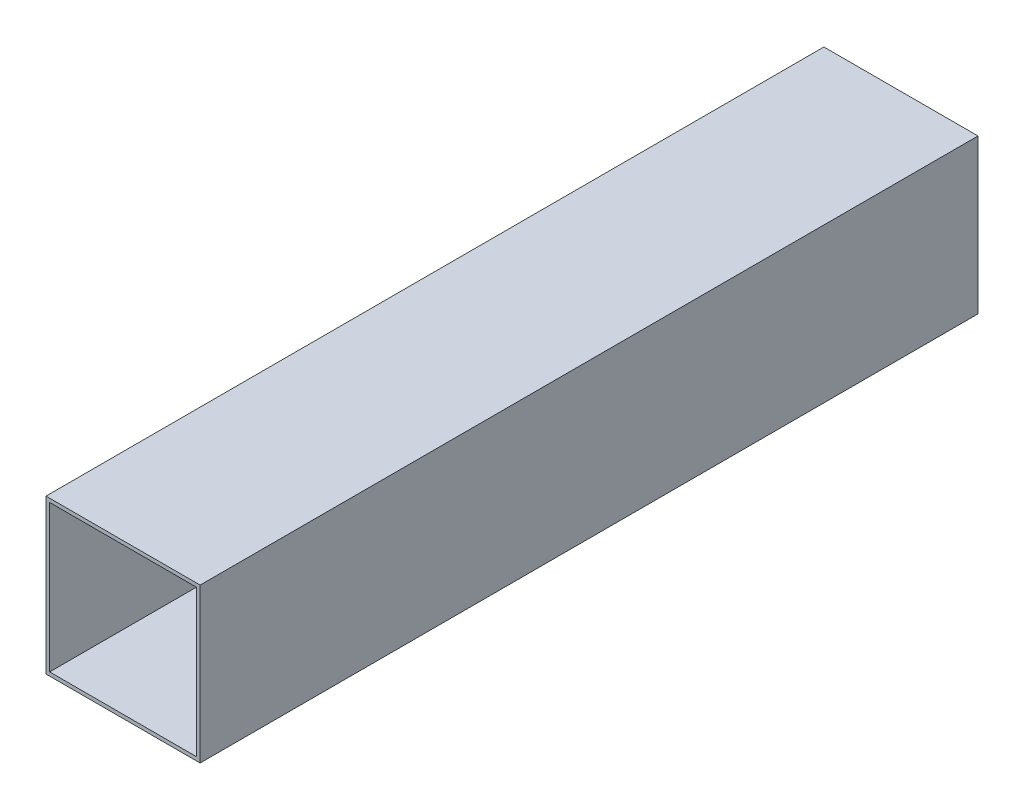
ISO-10303-21;
HEADER;
FILE_DESCRIPTION(('STEP AP214'),'2;1');
FILE_NAME('part.step','',(''),(''),'','','');
FILE_SCHEMA(('AUTOMOTIVE_DESIGN { 1 0 10303 214 1 1 1 1 }'));
ENDSEC;
DATA;
#1=APPLICATION_CONTEXT('core data for automotive mechanical design processes');
#2=APPLICATION_PROTOCOL_DEFINITION('international standard','automotive_design',2000,#1);
#3=PRODUCT_CONTEXT('',#1,'mechanical');
#4=PRODUCT('Part','Part','',(#3));
#5=PRODUCT_RELATED_PRODUCT_CATEGORY('part','',(#4));
#6=PRODUCT_DEFINITION_FORMATION('','',#4);
#7=PRODUCT_DEFINITION_CONTEXT('part definition',#1,'design');
#8=PRODUCT_DEFINITION('design','',#6,#7);
#9=PRODUCT_DEFINITION_SHAPE('','',#8);
#10=(LENGTH_UNIT() NAMED_UNIT(*) SI_UNIT(.MILLI.,.METRE.));
#11=(NAMED_UNIT(*) PLANE_ANGLE_UNIT() SI_UNIT($,.RADIAN.));
#12=(NAMED_UNIT(*) SI_UNIT($,.STERADIAN.) SOLID_ANGLE_UNIT());
#13=UNCERTAINTY_MEASURE_WITH_UNIT(LENGTH_MEASURE(1.E-05),#10,'distance_accuracy_value','');
#14=(GEOMETRIC_REPRESENTATION_CONTEXT(3) GLOBAL_UNCERTAINTY_ASSIGNED_CONTEXT((#13)) GLOBAL_UNIT_ASSIGNED_CONTEXT((#10,
#11,#12)) REPRESENTATION_CONTEXT('',''));
#15=CARTESIAN_POINT('',(0.,0.,0.));
#16=DIRECTION('',(0.,0.,1.));
#17=DIRECTION('',(1.,0.,0.));
#18=AXIS2_PLACEMENT_3D('',#15,#16,#17);
#19=CARTESIAN_POINT('',(0.,0.,530.));
#20=DIRECTION('',(0.,0.,1.));
#21=DIRECTION('',(1.,0.,0.));
#22=AXIS2_PLACEMENT_3D('',#19,#20,#21);
#23=PLANE('',#22);
#24=DIRECTION('',(0.,1.,0.));
#25=VECTOR('',#24,1.);
#26=CARTESIAN_POINT('',(52.5,52.5,530.));
#27=LINE('',#26,#25);
#28=CARTESIAN_POINT('',(52.5,-52.5,530.));
#29=VERTEX_POINT('',#28);
#30=CARTESIAN_POINT('',(52.5,52.5,530.));
#31=VERTEX_POINT('',#30);
#32=EDGE_CURVE('E242',#29,#31,#27,.T.);
#33=ORIENTED_EDGE('',*,*,#32,.T.);
#34=DIRECTION('',(-1.,0.,0.));
#35=VECTOR('',#34,1.);
#36=CARTESIAN_POINT('',(-52.5,52.5,530.));
#37=LINE('',#36,#35);
#38=CARTESIAN_POINT('',(-52.5,52.5,530.));
#39=VERTEX_POINT('',#38);
#40=EDGE_CURVE('E246',#31,#39,#37,.T.);
#41=ORIENTED_EDGE('',*,*,#40,.T.);
#42=DIRECTION('',(0.,-1.,0.));
#43=VECTOR('',#42,1.);
#44=CARTESIAN_POINT('',(-52.5,52.5,530.));
#45=LINE('',#44,#43);
#46=CARTESIAN_POINT('',(-52.5,-52.5,530.));
#47=VERTEX_POINT('',#46);
#48=EDGE_CURVE('E250',#39,#47,#45,.T.);
#49=ORIENTED_EDGE('',*,*,#48,.T.);
#50=DIRECTION('',(1.,0.,0.));
#51=VECTOR('',#50,1.);
#52=CARTESIAN_POINT('',(-52.5,-52.5,530.));
#53=LINE('',#52,#51);
#54=EDGE_CURVE('E253',#47,#29,#53,.T.);
#55=ORIENTED_EDGE('',*,*,#54,.T.);
#56=EDGE_LOOP('',(#33,#41,#49,#55));
#57=FACE_BOUND('',#56,.T.);
#58=DIRECTION('',(-1.,0.,0.));
#59=VECTOR('',#58,1.);
#60=CARTESIAN_POINT('',(-50.,50.,530.));
#61=LINE('',#60,#59);
#62=CARTESIAN_POINT('',(50.,50.,530.));
#63=VERTEX_POINT('',#62);
#64=CARTESIAN_POINT('',(-50.,50.,530.));
#65=VERTEX_POINT('',#64);
#66=EDGE_CURVE('E202',#63,#65,#61,.T.);
#67=ORIENTED_EDGE('',*,*,#66,.F.);
#68=DIRECTION('',(0.,1.,0.));
#69=VECTOR('',#68,1.);
#70=CARTESIAN_POINT('',(50.,-50.,530.));
#71=LINE('',#70,#69);
#72=CARTESIAN_POINT('',(50.,-50.,530.));
#73=VERTEX_POINT('',#72);
#74=EDGE_CURVE('E199',#73,#63,#71,.T.);
#75=ORIENTED_EDGE('',*,*,#74,.F.);
#76=DIRECTION('',(1.,0.,0.));
#77=VECTOR('',#76,1.);
#78=CARTESIAN_POINT('',(-50.,-50.,530.));
#79=LINE('',#78,#77);
#80=CARTESIAN_POINT('',(-50.,-50.,530.));
#81=VERTEX_POINT('',#80);
#82=EDGE_CURVE('E210',#81,#73,#79,.T.);
#83=ORIENTED_EDGE('',*,*,#82,.F.);
#84=DIRECTION('',(0.,-1.,0.));
#85=VECTOR('',#84,1.);
#86=CARTESIAN_POINT('',(-50.,-50.,530.));
#87=LINE('',#86,#85);
#88=EDGE_CURVE('E206',#65,#81,#87,.T.);
#89=ORIENTED_EDGE('',*,*,#88,.F.);
#90=EDGE_LOOP('',(#67,#75,#83,#89));
#91=FACE_BOUND('',#90,.T.);
#92=ADVANCED_FACE('F38',(#57,#91),#23,.T.);
#93=CARTESIAN_POINT('',(0.,0.,0.));
#94=DIRECTION('',(0.,0.,1.));
#95=DIRECTION('',(1.,0.,0.));
#96=AXIS2_PLACEMENT_3D('',#93,#94,#95);
#97=PLANE('',#96);
#98=DIRECTION('',(0.,1.,0.));
#99=VECTOR('',#98,1.);
#100=CARTESIAN_POINT('',(52.5,52.5,0.));
#101=LINE('',#100,#99);
#102=CARTESIAN_POINT('',(52.5,-52.5,0.));
#103=VERTEX_POINT('',#102);
#104=CARTESIAN_POINT('',(52.5,52.5,0.));
#105=VERTEX_POINT('',#104);
#106=EDGE_CURVE('E241',#103,#105,#101,.T.);
#107=ORIENTED_EDGE('',*,*,#106,.F.);
#108=DIRECTION('',(1.,0.,0.));
#109=VECTOR('',#108,1.);
#110=CARTESIAN_POINT('',(-52.5,-52.5,0.));
#111=LINE('',#110,#109);
#112=CARTESIAN_POINT('',(-52.5,-52.5,0.));
#113=VERTEX_POINT('',#112);
#114=EDGE_CURVE('E247',#113,#103,#111,.T.);
#115=ORIENTED_EDGE('',*,*,#114,.F.);
#116=DIRECTION('',(0.,-1.,0.));
#117=VECTOR('',#116,1.);
#118=CARTESIAN_POINT('',(-52.5,52.5,0.));
#119=LINE('',#118,#117);
#120=CARTESIAN_POINT('',(-52.5,52.5,0.));
#121=VERTEX_POINT('',#120);
#122=EDGE_CURVE('E263',#121,#113,#119,.T.);
#123=ORIENTED_EDGE('',*,*,#122,.F.);
#124=DIRECTION('',(-1.,0.,0.));
#125=VECTOR('',#124,1.);
#126=CARTESIAN_POINT('',(-52.5,52.5,0.));
#127=LINE('',#126,#125);
#128=EDGE_CURVE('E260',#105,#121,#127,.T.);
#129=ORIENTED_EDGE('',*,*,#128,.F.);
#130=EDGE_LOOP('',(#107,#115,#123,#129));
#131=FACE_BOUND('',#130,.T.);
#132=DIRECTION('',(0.,1.,0.));
#133=VECTOR('',#132,1.);
#134=CARTESIAN_POINT('',(50.,-50.,0.));
#135=LINE('',#134,#133);
#136=CARTESIAN_POINT('',(50.,-50.,0.));
#137=VERTEX_POINT('',#136);
#138=CARTESIAN_POINT('',(50.,50.,0.));
#139=VERTEX_POINT('',#138);
#140=EDGE_CURVE('E198',#137,#139,#135,.T.);
#141=ORIENTED_EDGE('',*,*,#140,.T.);
#142=DIRECTION('',(-1.,0.,0.));
#143=VECTOR('',#142,1.);
#144=CARTESIAN_POINT('',(-50.,50.,0.));
#145=LINE('',#144,#143);
#146=CARTESIAN_POINT('',(-50.,50.,0.));
#147=VERTEX_POINT('',#146);
#148=EDGE_CURVE('E217',#139,#147,#145,.T.);
#149=ORIENTED_EDGE('',*,*,#148,.T.);
#150=DIRECTION('',(0.,-1.,0.));
#151=VECTOR('',#150,1.);
#152=CARTESIAN_POINT('',(-50.,-50.,0.));
#153=LINE('',#152,#151);
#154=CARTESIAN_POINT('',(-50.,-50.,0.));
#155=VERTEX_POINT('',#154);
#156=EDGE_CURVE('E221',#147,#155,#153,.T.);
#157=ORIENTED_EDGE('',*,*,#156,.T.);
#158=DIRECTION('',(1.,0.,0.));
#159=VECTOR('',#158,1.);
#160=CARTESIAN_POINT('',(-50.,-50.,0.));
#161=LINE('',#160,#159);
#162=EDGE_CURVE('E203',#155,#137,#161,.T.);
#163=ORIENTED_EDGE('',*,*,#162,.T.);
#164=EDGE_LOOP('',(#141,#149,#157,#163));
#165=FACE_BOUND('',#164,.T.);
#166=ADVANCED_FACE('F354',(#131,#165),#97,.F.);
#167=CARTESIAN_POINT('',(52.5,52.5,530.));
#168=DIRECTION('',(-1.,0.,0.));
#169=DIRECTION('',(0.,-1.,0.));
#170=AXIS2_PLACEMENT_3D('',#167,#168,#169);
#171=PLANE('',#170);
#172=ORIENTED_EDGE('',*,*,#106,.T.);
#173=DIRECTION('',(0.,0.,-1.));
#174=VECTOR('',#173,1.);
#175=CARTESIAN_POINT('',(52.5,52.5,530.));
#176=LINE('',#175,#174);
#177=EDGE_CURVE('E279',#31,#105,#176,.T.);
#178=ORIENTED_EDGE('',*,*,#177,.F.);
#179=ORIENTED_EDGE('',*,*,#32,.F.);
#180=DIRECTION('',(0.,0.,-1.));
#181=VECTOR('',#180,1.);
#182=CARTESIAN_POINT('',(52.5,-52.5,530.));
#183=LINE('',#182,#181);
#184=EDGE_CURVE('E256',#29,#103,#183,.T.);
#185=ORIENTED_EDGE('',*,*,#184,.T.);
#186=EDGE_LOOP('',(#172,#178,#179,#185));
#187=FACE_BOUND('',#186,.T.);
#188=ADVANCED_FACE('F40',(#187),#171,.F.);
#189=CARTESIAN_POINT('',(-52.5,52.5,530.));
#190=DIRECTION('',(0.,-1.,0.));
#191=DIRECTION('',(0.,0.,-1.));
#192=AXIS2_PLACEMENT_3D('',#189,#190,#191);
#193=PLANE('',#192);
#194=ORIENTED_EDGE('',*,*,#128,.T.);
#195=DIRECTION('',(0.,0.,-1.));
#196=VECTOR('',#195,1.);
#197=CARTESIAN_POINT('',(-52.5,52.5,530.));
#198=LINE('',#197,#196);
#199=EDGE_CURVE('E275',#39,#121,#198,.T.);
#200=ORIENTED_EDGE('',*,*,#199,.F.);
#201=ORIENTED_EDGE('',*,*,#40,.F.);
#202=ORIENTED_EDGE('',*,*,#177,.T.);
#203=EDGE_LOOP('',(#194,#200,#201,#202));
#204=FACE_BOUND('',#203,.T.);
#205=ADVANCED_FACE('F389',(#204),#193,.F.);
#206=CARTESIAN_POINT('',(-52.5,52.5,530.));
#207=DIRECTION('',(1.,0.,0.));
#208=DIRECTION('',(0.,1.,0.));
#209=AXIS2_PLACEMENT_3D('',#206,#207,#208);
#210=PLANE('',#209);
#211=ORIENTED_EDGE('',*,*,#122,.T.);
#212=DIRECTION('',(0.,0.,-1.));
#213=VECTOR('',#212,1.);
#214=CARTESIAN_POINT('',(-52.5,-52.5,530.));
#215=LINE('',#214,#213);
#216=EDGE_CURVE('E271',#47,#113,#215,.T.);
#217=ORIENTED_EDGE('',*,*,#216,.F.);
#218=ORIENTED_EDGE('',*,*,#48,.F.);
#219=ORIENTED_EDGE('',*,*,#199,.T.);
#220=EDGE_LOOP('',(#211,#217,#218,#219));
#221=FACE_BOUND('',#220,.T.);
#222=ADVANCED_FACE('F386',(#221),#210,.F.);
#223=CARTESIAN_POINT('',(-52.5,-52.5,530.));
#224=DIRECTION('',(0.,1.,0.));
#225=DIRECTION('',(0.,0.,1.));
#226=AXIS2_PLACEMENT_3D('',#223,#224,#225);
#227=PLANE('',#226);
#228=DIRECTION('',(-1.,0.,0.));
#229=VECTOR('',#228,1.);
#230=CARTESIAN_POINT('',(-52.5000000000002,-52.5,90.));
#231=LINE('',#230,#229);
#232=CARTESIAN_POINT('',(35.9607942738874,-52.5,90.));
#233=VERTEX_POINT('',#232);
#234=CARTESIAN_POINT('',(-34.0392057261126,-52.5,90.));
#235=VERTEX_POINT('',#234);
#236=EDGE_CURVE('E190',#233,#235,#231,.T.);
#237=ORIENTED_EDGE('',*,*,#236,.T.);
#238=DIRECTION('',(0.,0.,1.));
#239=VECTOR('',#238,1.);
#240=CARTESIAN_POINT('',(-34.0392057261126,-52.5,530.));
#241=LINE('',#240,#239);
#242=CARTESIAN_POINT('',(-34.0392057261126,-52.5,150.));
#243=VERTEX_POINT('',#242);
#244=EDGE_CURVE('E194',#235,#243,#241,.T.);
#245=ORIENTED_EDGE('',*,*,#244,.T.);
#246=DIRECTION('',(1.,0.,0.));
#247=VECTOR('',#246,1.);
#248=CARTESIAN_POINT('',(-52.5000000000001,-52.5,150.));
#249=LINE('',#248,#247);
#250=CARTESIAN_POINT('',(35.9607942738875,-52.5,150.));
#251=VERTEX_POINT('',#250);
#252=EDGE_CURVE('E177',#243,#251,#249,.T.);
#253=ORIENTED_EDGE('',*,*,#252,.T.);
#254=DIRECTION('',(0.,0.,-1.));
#255=VECTOR('',#254,1.);
#256=CARTESIAN_POINT('',(35.9607942738875,-52.5,530.));
#257=LINE('',#256,#255);
#258=EDGE_CURVE('E182',#251,#233,#257,.T.);
#259=ORIENTED_EDGE('',*,*,#258,.T.);
#260=EDGE_LOOP('',(#237,#245,#253,#259));
#261=FACE_BOUND('',#260,.T.);
#262=DIRECTION('',(-1.,0.,0.));
#263=VECTOR('',#262,1.);
#264=CARTESIAN_POINT('',(-52.5,-52.5,300.));
#265=LINE('',#264,#263);
#266=CARTESIAN_POINT('',(35.9607942738874,-52.5,300.));
#267=VERTEX_POINT('',#266);
#268=CARTESIAN_POINT('',(-34.0392057261126,-52.5,300.));
#269=VERTEX_POINT('',#268);
#270=EDGE_CURVE('E175',#267,#269,#265,.T.);
#271=ORIENTED_EDGE('',*,*,#270,.T.);
#272=DIRECTION('',(0.,0.,1.));
#273=VECTOR('',#272,1.);
#274=CARTESIAN_POINT('',(-34.0392057261126,-52.5,530.));
#275=LINE('',#274,#273);
#276=CARTESIAN_POINT('',(-34.0392057261126,-52.5,360.));
#277=VERTEX_POINT('',#276);
#278=EDGE_CURVE('E165',#269,#277,#275,.T.);
#279=ORIENTED_EDGE('',*,*,#278,.T.);
#280=DIRECTION('',(1.,0.,0.));
#281=VECTOR('',#280,1.);
#282=CARTESIAN_POINT('',(-52.5,-52.5,360.));
#283=LINE('',#282,#281);
#284=CARTESIAN_POINT('',(35.9607942738875,-52.5,360.));
#285=VERTEX_POINT('',#284);
#286=EDGE_CURVE('E150',#277,#285,#283,.T.);
#287=ORIENTED_EDGE('',*,*,#286,.T.);
#288=DIRECTION('',(0.,0.,-1.));
#289=VECTOR('',#288,1.);
#290=CARTESIAN_POINT('',(35.9607942738875,-52.5,530.));
#291=LINE('',#290,#289);
#292=EDGE_CURVE('E159',#285,#267,#291,.T.);
#293=ORIENTED_EDGE('',*,*,#292,.T.);
#294=EDGE_LOOP('',(#271,#279,#287,#293));
#295=FACE_BOUND('',#294,.T.);
#296=ORIENTED_EDGE('',*,*,#114,.T.);
#297=ORIENTED_EDGE('',*,*,#184,.F.);
#298=ORIENTED_EDGE('',*,*,#54,.F.);
#299=ORIENTED_EDGE('',*,*,#216,.T.);
#300=EDGE_LOOP('',(#296,#297,#298,#299));
#301=FACE_BOUND('',#300,.T.);
#302=ADVANCED_FACE('F173',(#261,#295,#301),#227,.F.);
#303=CARTESIAN_POINT('',(50.,-50.,530.));
#304=DIRECTION('',(-1.,0.,0.));
#305=DIRECTION('',(0.,0.,1.));
#306=AXIS2_PLACEMENT_3D('',#303,#304,#305);
#307=PLANE('',#306);
#308=ORIENTED_EDGE('',*,*,#140,.F.);
#309=DIRECTION('',(0.,0.,-1.));
#310=VECTOR('',#309,1.);
#311=CARTESIAN_POINT('',(50.,-50.,530.));
#312=LINE('',#311,#310);
#313=EDGE_CURVE('E213',#73,#137,#312,.T.);
#314=ORIENTED_EDGE('',*,*,#313,.F.);
#315=ORIENTED_EDGE('',*,*,#74,.T.);
#316=DIRECTION('',(0.,0.,-1.));
#317=VECTOR('',#316,1.);
#318=CARTESIAN_POINT('',(50.,50.,530.));
#319=LINE('',#318,#317);
#320=EDGE_CURVE('E237',#63,#139,#319,.T.);
#321=ORIENTED_EDGE('',*,*,#320,.T.);
#322=EDGE_LOOP('',(#308,#314,#315,#321));
#323=FACE_BOUND('',#322,.T.);
#324=ADVANCED_FACE('F363',(#323),#307,.T.);
#325=CARTESIAN_POINT('',(-50.,50.,530.));
#326=DIRECTION('',(0.,-1.,0.));
#327=DIRECTION('',(0.,0.,-1.));
#328=AXIS2_PLACEMENT_3D('',#325,#326,#327);
#329=PLANE('',#328);
#330=ORIENTED_EDGE('',*,*,#148,.F.);
#331=ORIENTED_EDGE('',*,*,#320,.F.);
#332=ORIENTED_EDGE('',*,*,#66,.T.);
#333=DIRECTION('',(0.,0.,-1.));
#334=VECTOR('',#333,1.);
#335=CARTESIAN_POINT('',(-50.,50.,530.));
#336=LINE('',#335,#334);
#337=EDGE_CURVE('E234',#65,#147,#336,.T.);
#338=ORIENTED_EDGE('',*,*,#337,.T.);
#339=EDGE_LOOP('',(#330,#331,#332,#338));
#340=FACE_BOUND('',#339,.T.);
#341=ADVANCED_FACE('F366',(#340),#329,.T.);
#342=CARTESIAN_POINT('',(-50.,-50.,530.));
#343=DIRECTION('',(1.,0.,0.));
#344=DIRECTION('',(0.,0.,-1.));
#345=AXIS2_PLACEMENT_3D('',#342,#343,#344);
#346=PLANE('',#345);
#347=ORIENTED_EDGE('',*,*,#156,.F.);
#348=ORIENTED_EDGE('',*,*,#337,.F.);
#349=ORIENTED_EDGE('',*,*,#88,.T.);
#350=DIRECTION('',(0.,0.,-1.));
#351=VECTOR('',#350,1.);
#352=CARTESIAN_POINT('',(-50.,-50.,530.));
#353=LINE('',#352,#351);
#354=EDGE_CURVE('E231',#81,#155,#353,.T.);
#355=ORIENTED_EDGE('',*,*,#354,.T.);
#356=EDGE_LOOP('',(#347,#348,#349,#355));
#357=FACE_BOUND('',#356,.T.);
#358=ADVANCED_FACE('F348',(#357),#346,.T.);
#359=CARTESIAN_POINT('',(-50.,-50.,530.));
#360=DIRECTION('',(0.,1.,0.));
#361=DIRECTION('',(0.,0.,1.));
#362=AXIS2_PLACEMENT_3D('',#359,#360,#361);
#363=PLANE('',#362);
#364=DIRECTION('',(0.,0.,1.));
#365=VECTOR('',#364,1.);
#366=CARTESIAN_POINT('',(-34.0392057261126,-50.,530.));
#367=LINE('',#366,#365);
#368=CARTESIAN_POINT('',(-34.0392057261126,-50.,90.));
#369=VERTEX_POINT('',#368);
#370=CARTESIAN_POINT('',(-34.0392057261126,-50.,150.));
#371=VERTEX_POINT('',#370);
#372=EDGE_CURVE('E11',#369,#371,#367,.T.);
#373=ORIENTED_EDGE('',*,*,#372,.F.);
#374=DIRECTION('',(-1.,0.,0.));
#375=VECTOR('',#374,1.);
#376=CARTESIAN_POINT('',(-50.0000000000003,-50.,90.));
#377=LINE('',#376,#375);
#378=CARTESIAN_POINT('',(35.9607942738874,-50.,90.));
#379=VERTEX_POINT('',#378);
#380=EDGE_CURVE('E47',#379,#369,#377,.T.);
#381=ORIENTED_EDGE('',*,*,#380,.F.);
#382=DIRECTION('',(0.,0.,-1.));
#383=VECTOR('',#382,1.);
#384=CARTESIAN_POINT('',(35.9607942738875,-50.,530.));
#385=LINE('',#384,#383);
#386=CARTESIAN_POINT('',(35.9607942738875,-50.,150.));
#387=VERTEX_POINT('',#386);
#388=EDGE_CURVE('E297',#387,#379,#385,.T.);
#389=ORIENTED_EDGE('',*,*,#388,.F.);
#390=DIRECTION('',(1.,0.,0.));
#391=VECTOR('',#390,1.);
#392=CARTESIAN_POINT('',(-50.0000000000002,-50.,150.));
#393=LINE('',#392,#391);
#394=EDGE_CURVE('E294',#371,#387,#393,.T.);
#395=ORIENTED_EDGE('',*,*,#394,.F.);
#396=EDGE_LOOP('',(#373,#381,#389,#395));
#397=FACE_BOUND('',#396,.T.);
#398=DIRECTION('',(0.,0.,1.));
#399=VECTOR('',#398,1.);
#400=CARTESIAN_POINT('',(-34.0392057261126,-50.,530.));
#401=LINE('',#400,#399);
#402=CARTESIAN_POINT('',(-34.0392057261126,-50.,300.));
#403=VERTEX_POINT('',#402);
#404=CARTESIAN_POINT('',(-34.0392057261126,-50.,360.));
#405=VERTEX_POINT('',#404);
#406=EDGE_CURVE('E168',#403,#405,#401,.T.);
#407=ORIENTED_EDGE('',*,*,#406,.F.);
#408=DIRECTION('',(-1.,0.,0.));
#409=VECTOR('',#408,1.);
#410=CARTESIAN_POINT('',(-50.,-50.,300.));
#411=LINE('',#410,#409);
#412=CARTESIAN_POINT('',(35.9607942738874,-50.,300.));
#413=VERTEX_POINT('',#412);
#414=EDGE_CURVE('E289',#413,#403,#411,.T.);
#415=ORIENTED_EDGE('',*,*,#414,.F.);
#416=DIRECTION('',(0.,0.,-1.));
#417=VECTOR('',#416,1.);
#418=CARTESIAN_POINT('',(35.9607942738875,-50.,530.));
#419=LINE('',#418,#417);
#420=CARTESIAN_POINT('',(35.9607942738875,-50.,360.));
#421=VERTEX_POINT('',#420);
#422=EDGE_CURVE('E286',#421,#413,#419,.T.);
#423=ORIENTED_EDGE('',*,*,#422,.F.);
#424=DIRECTION('',(1.,0.,0.));
#425=VECTOR('',#424,1.);
#426=CARTESIAN_POINT('',(-50.,-50.,360.));
#427=LINE('',#426,#425);
#428=EDGE_CURVE('E283',#405,#421,#427,.T.);
#429=ORIENTED_EDGE('',*,*,#428,.F.);
#430=EDGE_LOOP('',(#407,#415,#423,#429));
#431=FACE_BOUND('',#430,.T.);
#432=ORIENTED_EDGE('',*,*,#162,.F.);
#433=ORIENTED_EDGE('',*,*,#354,.F.);
#434=ORIENTED_EDGE('',*,*,#82,.T.);
#435=ORIENTED_EDGE('',*,*,#313,.T.);
#436=EDGE_LOOP('',(#432,#433,#434,#435));
#437=FACE_BOUND('',#436,.T.);
#438=ADVANCED_FACE('F317',(#397,#431,#437),#363,.T.);
#439=CARTESIAN_POINT('',(-34.0392057261126,-530.,300.));
#440=DIRECTION('',(-1.,0.,0.));
#441=DIRECTION('',(0.,0.,1.));
#442=AXIS2_PLACEMENT_3D('',#439,#440,#441);
#443=PLANE('',#442);
#444=DIRECTION('',(0.,1.,0.));
#445=VECTOR('',#444,1.);
#446=CARTESIAN_POINT('',(-34.0392057261126,-530.,300.));
#447=LINE('',#446,#445);
#448=EDGE_CURVE('E328',#269,#403,#447,.T.);
#449=ORIENTED_EDGE('',*,*,#448,.T.);
#450=ORIENTED_EDGE('',*,*,#406,.T.);
#451=DIRECTION('',(0.,1.,0.));
#452=VECTOR('',#451,1.);
#453=CARTESIAN_POINT('',(-34.0392057261126,-530.,360.));
#454=LINE('',#453,#452);
#455=EDGE_CURVE('E153',#277,#405,#454,.T.);
#456=ORIENTED_EDGE('',*,*,#455,.F.);
#457=ORIENTED_EDGE('',*,*,#278,.F.);
#458=EDGE_LOOP('',(#449,#450,#456,#457));
#459=FACE_BOUND('',#458,.T.);
#460=ADVANCED_FACE('F164',(#459),#443,.F.);
#461=CARTESIAN_POINT('',(35.9607942738874,-530.,300.));
#462=DIRECTION('',(0.,0.,-1.));
#463=DIRECTION('',(-1.,0.,0.));
#464=AXIS2_PLACEMENT_3D('',#461,#462,#463);
#465=PLANE('',#464);
#466=DIRECTION('',(0.,1.,0.));
#467=VECTOR('',#466,1.);
#468=CARTESIAN_POINT('',(35.9607942738874,-530.,300.));
#469=LINE('',#468,#467);
#470=EDGE_CURVE('E333',#267,#413,#469,.T.);
#471=ORIENTED_EDGE('',*,*,#470,.T.);
#472=ORIENTED_EDGE('',*,*,#414,.T.);
#473=ORIENTED_EDGE('',*,*,#448,.F.);
#474=ORIENTED_EDGE('',*,*,#270,.F.);
#475=EDGE_LOOP('',(#471,#472,#473,#474));
#476=FACE_BOUND('',#475,.T.);
#477=ADVANCED_FACE('F345',(#476),#465,.F.);
#478=CARTESIAN_POINT('',(35.9607942738874,-530.,300.));
#479=DIRECTION('',(1.,0.,0.));
#480=DIRECTION('',(0.,0.,-1.));
#481=AXIS2_PLACEMENT_3D('',#478,#479,#480);
#482=PLANE('',#481);
#483=DIRECTION('',(0.,1.,0.));
#484=VECTOR('',#483,1.);
#485=CARTESIAN_POINT('',(35.9607942738875,-530.,360.));
#486=LINE('',#485,#484);
#487=EDGE_CURVE('E62',#285,#421,#486,.T.);
#488=ORIENTED_EDGE('',*,*,#487,.T.);
#489=ORIENTED_EDGE('',*,*,#422,.T.);
#490=ORIENTED_EDGE('',*,*,#470,.F.);
#491=ORIENTED_EDGE('',*,*,#292,.F.);
#492=EDGE_LOOP('',(#488,#489,#490,#491));
#493=FACE_BOUND('',#492,.T.);
#494=ADVANCED_FACE('F341',(#493),#482,.F.);
#495=CARTESIAN_POINT('',(35.9607942738875,-530.,360.));
#496=DIRECTION('',(0.,0.,1.));
#497=DIRECTION('',(1.,0.,0.));
#498=AXIS2_PLACEMENT_3D('',#495,#496,#497);
#499=PLANE('',#498);
#500=ORIENTED_EDGE('',*,*,#455,.T.);
#501=ORIENTED_EDGE('',*,*,#428,.T.);
#502=ORIENTED_EDGE('',*,*,#487,.F.);
#503=ORIENTED_EDGE('',*,*,#286,.F.);
#504=EDGE_LOOP('',(#500,#501,#502,#503));
#505=FACE_BOUND('',#504,.T.);
#506=ADVANCED_FACE('F152',(#505),#499,.F.);
#507=CARTESIAN_POINT('',(-34.0392057261126,-530.,90.));
#508=DIRECTION('',(-1.,0.,0.));
#509=DIRECTION('',(0.,0.,1.));
#510=AXIS2_PLACEMENT_3D('',#507,#508,#509);
#511=PLANE('',#510);
#512=DIRECTION('',(0.,1.,0.));
#513=VECTOR('',#512,1.);
#514=CARTESIAN_POINT('',(-34.0392057261126,-530.,90.));
#515=LINE('',#514,#513);
#516=EDGE_CURVE('E160',#235,#369,#515,.T.);
#517=ORIENTED_EDGE('',*,*,#516,.T.);
#518=ORIENTED_EDGE('',*,*,#372,.T.);
#519=DIRECTION('',(0.,1.,0.));
#520=VECTOR('',#519,1.);
#521=CARTESIAN_POINT('',(-34.0392057261126,-530.,150.));
#522=LINE('',#521,#520);
#523=EDGE_CURVE('E320',#243,#371,#522,.T.);
#524=ORIENTED_EDGE('',*,*,#523,.F.);
#525=ORIENTED_EDGE('',*,*,#244,.F.);
#526=EDGE_LOOP('',(#517,#518,#524,#525));
#527=FACE_BOUND('',#526,.T.);
#528=ADVANCED_FACE('F312',(#527),#511,.F.);
#529=CARTESIAN_POINT('',(35.9607942738874,-530.,90.));
#530=DIRECTION('',(0.,0.,-1.));
#531=DIRECTION('',(-1.,0.,0.));
#532=AXIS2_PLACEMENT_3D('',#529,#530,#531);
#533=PLANE('',#532);
#534=DIRECTION('',(0.,1.,0.));
#535=VECTOR('',#534,1.);
#536=CARTESIAN_POINT('',(35.9607942738874,-530.,90.));
#537=LINE('',#536,#535);
#538=EDGE_CURVE('E307',#233,#379,#537,.T.);
#539=ORIENTED_EDGE('',*,*,#538,.T.);
#540=ORIENTED_EDGE('',*,*,#380,.T.);
#541=ORIENTED_EDGE('',*,*,#516,.F.);
#542=ORIENTED_EDGE('',*,*,#236,.F.);
#543=EDGE_LOOP('',(#539,#540,#541,#542));
#544=FACE_BOUND('',#543,.T.);
#545=ADVANCED_FACE('F305',(#544),#533,.F.);
#546=CARTESIAN_POINT('',(35.9607942738874,-530.,90.));
#547=DIRECTION('',(1.,0.,0.));
#548=DIRECTION('',(0.,0.,-1.));
#549=AXIS2_PLACEMENT_3D('',#546,#547,#548);
#550=PLANE('',#549);
#551=DIRECTION('',(0.,1.,0.));
#552=VECTOR('',#551,1.);
#553=CARTESIAN_POINT('',(35.9607942738875,-530.,150.));
#554=LINE('',#553,#552);
#555=EDGE_CURVE('E54',#251,#387,#554,.T.);
#556=ORIENTED_EDGE('',*,*,#555,.T.);
#557=ORIENTED_EDGE('',*,*,#388,.T.);
#558=ORIENTED_EDGE('',*,*,#538,.F.);
#559=ORIENTED_EDGE('',*,*,#258,.F.);
#560=EDGE_LOOP('',(#556,#557,#558,#559));
#561=FACE_BOUND('',#560,.T.);
#562=ADVANCED_FACE('F322',(#561),#550,.F.);
#563=CARTESIAN_POINT('',(35.9607942738875,-530.,150.));
#564=DIRECTION('',(0.,0.,1.));
#565=DIRECTION('',(1.,0.,0.));
#566=AXIS2_PLACEMENT_3D('',#563,#564,#565);
#567=PLANE('',#566);
#568=ORIENTED_EDGE('',*,*,#523,.T.);
#569=ORIENTED_EDGE('',*,*,#394,.T.);
#570=ORIENTED_EDGE('',*,*,#555,.F.);
#571=ORIENTED_EDGE('',*,*,#252,.F.);
#572=EDGE_LOOP('',(#568,#569,#570,#571));
#573=FACE_BOUND('',#572,.T.);
#574=ADVANCED_FACE('F319',(#573),#567,.F.);
#575=CLOSED_SHELL('',(#92,#166,#188,#205,#222,#302,#324,#341,#358,#438,#460,#477,#494,#506,#528,
#545,#562,#574));
#576=MANIFOLD_SOLID_BREP('B2',#575);
#577=ADVANCED_BREP_SHAPE_REPRESENTATION('',(#18,#576),#14);
#578=SHAPE_DEFINITION_REPRESENTATION(#9,#577);
ENDSEC;
END-ISO-10303-21;
